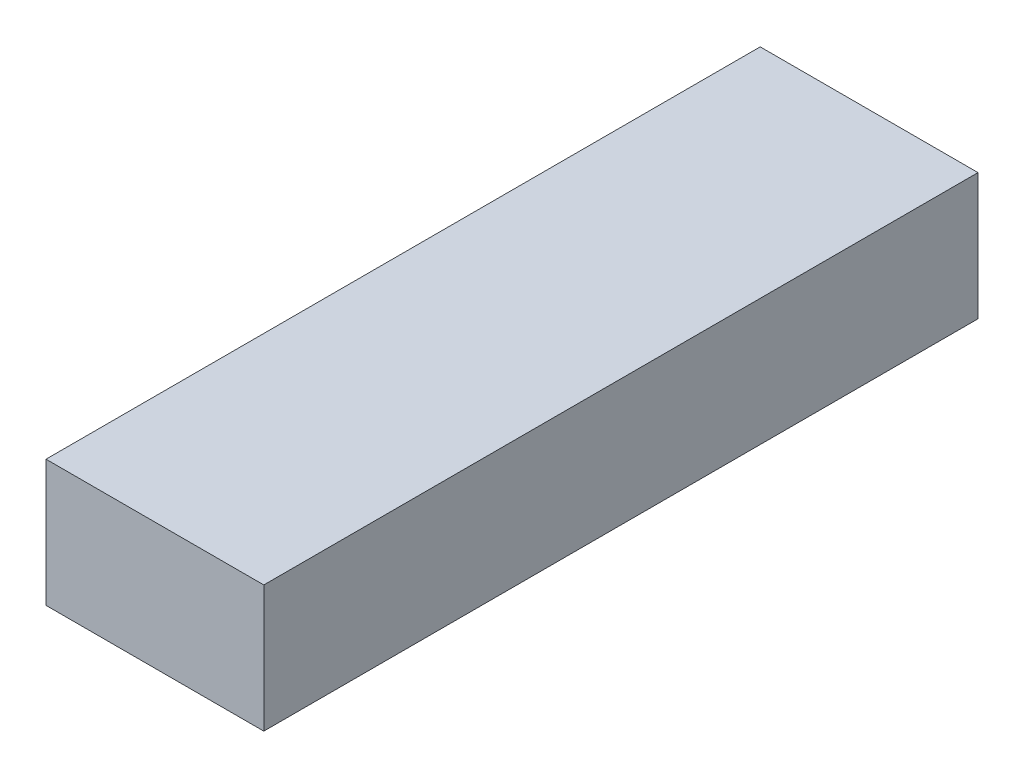
ISO-10303-21;
HEADER;
FILE_DESCRIPTION(('STEP AP214'),'2;1');
FILE_NAME('part.step','',(''),(''),'','','');
FILE_SCHEMA(('AUTOMOTIVE_DESIGN { 1 0 10303 214 1 1 1 1 }'));
ENDSEC;
DATA;
#1=APPLICATION_CONTEXT('core data for automotive mechanical design processes');
#2=APPLICATION_PROTOCOL_DEFINITION('international standard','automotive_design',2000,#1);
#3=PRODUCT_CONTEXT('',#1,'mechanical');
#4=PRODUCT('Part','Part','',(#3));
#5=PRODUCT_RELATED_PRODUCT_CATEGORY('part','',(#4));
#6=PRODUCT_DEFINITION_FORMATION('','',#4);
#7=PRODUCT_DEFINITION_CONTEXT('part definition',#1,'design');
#8=PRODUCT_DEFINITION('design','',#6,#7);
#9=PRODUCT_DEFINITION_SHAPE('','',#8);
#10=(LENGTH_UNIT() NAMED_UNIT(*) SI_UNIT(.MILLI.,.METRE.));
#11=(NAMED_UNIT(*) PLANE_ANGLE_UNIT() SI_UNIT($,.RADIAN.));
#12=(NAMED_UNIT(*) SI_UNIT($,.STERADIAN.) SOLID_ANGLE_UNIT());
#13=UNCERTAINTY_MEASURE_WITH_UNIT(LENGTH_MEASURE(1.E-05),#10,'distance_accuracy_value','');
#14=(GEOMETRIC_REPRESENTATION_CONTEXT(3) GLOBAL_UNCERTAINTY_ASSIGNED_CONTEXT((#13)) GLOBAL_UNIT_ASSIGNED_CONTEXT((#10,
#11,#12)) REPRESENTATION_CONTEXT('',''));
#15=CARTESIAN_POINT('',(0.,0.,0.));
#16=DIRECTION('',(0.,0.,1.));
#17=DIRECTION('',(1.,0.,0.));
#18=AXIS2_PLACEMENT_3D('',#15,#16,#17);
#19=CARTESIAN_POINT('',(21.5,-12.5,141.));
#20=DIRECTION('',(-1.,0.,0.));
#21=DIRECTION('',(0.,0.,1.));
#22=AXIS2_PLACEMENT_3D('',#19,#20,#21);
#23=PLANE('',#22);
#24=DIRECTION('',(0.,1.,0.));
#25=VECTOR('',#24,1.);
#26=CARTESIAN_POINT('',(21.5,-12.5,0.));
#27=LINE('',#26,#25);
#28=CARTESIAN_POINT('',(21.5,-12.5,0.));
#29=VERTEX_POINT('',#28);
#30=CARTESIAN_POINT('',(21.5,12.5,0.));
#31=VERTEX_POINT('',#30);
#32=EDGE_CURVE('E96',#29,#31,#27,.T.);
#33=ORIENTED_EDGE('',*,*,#32,.T.);
#34=DIRECTION('',(0.,0.,-1.));
#35=VECTOR('',#34,1.);
#36=CARTESIAN_POINT('',(21.5,12.5,141.));
#37=LINE('',#36,#35);
#38=CARTESIAN_POINT('',(21.5,12.5,141.));
#39=VERTEX_POINT('',#38);
#40=EDGE_CURVE('E11',#39,#31,#37,.T.);
#41=ORIENTED_EDGE('',*,*,#40,.F.);
#42=DIRECTION('',(0.,1.,0.));
#43=VECTOR('',#42,1.);
#44=CARTESIAN_POINT('',(21.5,-12.5,141.));
#45=LINE('',#44,#43);
#46=CARTESIAN_POINT('',(21.5,-12.5,141.));
#47=VERTEX_POINT('',#46);
#48=EDGE_CURVE('E84',#47,#39,#45,.T.);
#49=ORIENTED_EDGE('',*,*,#48,.F.);
#50=DIRECTION('',(0.,0.,-1.));
#51=VECTOR('',#50,1.);
#52=CARTESIAN_POINT('',(21.5,-12.5,141.));
#53=LINE('',#52,#51);
#54=EDGE_CURVE('E92',#47,#29,#53,.T.);
#55=ORIENTED_EDGE('',*,*,#54,.T.);
#56=EDGE_LOOP('',(#33,#41,#49,#55));
#57=FACE_BOUND('',#56,.T.);
#58=ADVANCED_FACE('F33',(#57),#23,.F.);
#59=CARTESIAN_POINT('',(-21.5,12.5,141.));
#60=DIRECTION('',(0.,-1.,0.));
#61=DIRECTION('',(0.,0.,-1.));
#62=AXIS2_PLACEMENT_3D('',#59,#60,#61);
#63=PLANE('',#62);
#64=DIRECTION('',(-1.,0.,0.));
#65=VECTOR('',#64,1.);
#66=CARTESIAN_POINT('',(-21.5,12.5,0.));
#67=LINE('',#66,#65);
#68=CARTESIAN_POINT('',(-21.5,12.5,0.));
#69=VERTEX_POINT('',#68);
#70=EDGE_CURVE('E88',#31,#69,#67,.T.);
#71=ORIENTED_EDGE('',*,*,#70,.T.);
#72=DIRECTION('',(0.,0.,-1.));
#73=VECTOR('',#72,1.);
#74=CARTESIAN_POINT('',(-21.5,12.5,141.));
#75=LINE('',#74,#73);
#76=CARTESIAN_POINT('',(-21.5,12.5,141.));
#77=VERTEX_POINT('',#76);
#78=EDGE_CURVE('E41',#77,#69,#75,.T.);
#79=ORIENTED_EDGE('',*,*,#78,.F.);
#80=DIRECTION('',(-1.,0.,0.));
#81=VECTOR('',#80,1.);
#82=CARTESIAN_POINT('',(-21.5,12.5,141.));
#83=LINE('',#82,#81);
#84=EDGE_CURVE('E79',#39,#77,#83,.T.);
#85=ORIENTED_EDGE('',*,*,#84,.F.);
#86=ORIENTED_EDGE('',*,*,#40,.T.);
#87=EDGE_LOOP('',(#71,#79,#85,#86));
#88=FACE_BOUND('',#87,.T.);
#89=ADVANCED_FACE('F87',(#88),#63,.F.);
#90=CARTESIAN_POINT('',(-21.5,-12.5,141.));
#91=DIRECTION('',(1.,0.,0.));
#92=DIRECTION('',(0.,0.,-1.));
#93=AXIS2_PLACEMENT_3D('',#90,#91,#92);
#94=PLANE('',#93);
#95=DIRECTION('',(0.,-1.,0.));
#96=VECTOR('',#95,1.);
#97=CARTESIAN_POINT('',(-21.5,-12.5,0.));
#98=LINE('',#97,#96);
#99=CARTESIAN_POINT('',(-21.5,-12.5,0.));
#100=VERTEX_POINT('',#99);
#101=EDGE_CURVE('E66',#69,#100,#98,.T.);
#102=ORIENTED_EDGE('',*,*,#101,.T.);
#103=DIRECTION('',(0.,0.,-1.));
#104=VECTOR('',#103,1.);
#105=CARTESIAN_POINT('',(-21.5,-12.5,141.));
#106=LINE('',#105,#104);
#107=CARTESIAN_POINT('',(-21.5,-12.5,141.));
#108=VERTEX_POINT('',#107);
#109=EDGE_CURVE('E89',#108,#100,#106,.T.);
#110=ORIENTED_EDGE('',*,*,#109,.F.);
#111=DIRECTION('',(0.,-1.,0.));
#112=VECTOR('',#111,1.);
#113=CARTESIAN_POINT('',(-21.5,-12.5,141.));
#114=LINE('',#113,#112);
#115=EDGE_CURVE('E82',#77,#108,#114,.T.);
#116=ORIENTED_EDGE('',*,*,#115,.F.);
#117=ORIENTED_EDGE('',*,*,#78,.T.);
#118=EDGE_LOOP('',(#102,#110,#116,#117));
#119=FACE_BOUND('',#118,.T.);
#120=ADVANCED_FACE('F90',(#119),#94,.F.);
#121=CARTESIAN_POINT('',(-21.5,-12.5,141.));
#122=DIRECTION('',(0.,1.,0.));
#123=DIRECTION('',(0.,0.,1.));
#124=AXIS2_PLACEMENT_3D('',#121,#122,#123);
#125=PLANE('',#124);
#126=DIRECTION('',(1.,0.,0.));
#127=VECTOR('',#126,1.);
#128=CARTESIAN_POINT('',(-21.5,-12.5,0.));
#129=LINE('',#128,#127);
#130=EDGE_CURVE('E72',#100,#29,#129,.T.);
#131=ORIENTED_EDGE('',*,*,#130,.T.);
#132=ORIENTED_EDGE('',*,*,#54,.F.);
#133=DIRECTION('',(1.,0.,0.));
#134=VECTOR('',#133,1.);
#135=CARTESIAN_POINT('',(-21.5,-12.5,141.));
#136=LINE('',#135,#134);
#137=EDGE_CURVE('E49',#108,#47,#136,.T.);
#138=ORIENTED_EDGE('',*,*,#137,.F.);
#139=ORIENTED_EDGE('',*,*,#109,.T.);
#140=EDGE_LOOP('',(#131,#132,#138,#139));
#141=FACE_BOUND('',#140,.T.);
#142=ADVANCED_FACE('F103',(#141),#125,.F.);
#143=CARTESIAN_POINT('',(0.,0.,141.));
#144=DIRECTION('',(0.,0.,-1.));
#145=DIRECTION('',(-1.,0.,0.));
#146=AXIS2_PLACEMENT_3D('',#143,#144,#145);
#147=PLANE('',#146);
#148=ORIENTED_EDGE('',*,*,#48,.T.);
#149=ORIENTED_EDGE('',*,*,#84,.T.);
#150=ORIENTED_EDGE('',*,*,#115,.T.);
#151=ORIENTED_EDGE('',*,*,#137,.T.);
#152=EDGE_LOOP('',(#148,#149,#150,#151));
#153=FACE_BOUND('',#152,.T.);
#154=ADVANCED_FACE('F80',(#153),#147,.F.);
#155=CARTESIAN_POINT('',(0.,0.,0.));
#156=DIRECTION('',(0.,0.,-1.));
#157=DIRECTION('',(-1.,0.,0.));
#158=AXIS2_PLACEMENT_3D('',#155,#156,#157);
#159=PLANE('',#158);
#160=ORIENTED_EDGE('',*,*,#32,.F.);
#161=ORIENTED_EDGE('',*,*,#130,.F.);
#162=ORIENTED_EDGE('',*,*,#101,.F.);
#163=ORIENTED_EDGE('',*,*,#70,.F.);
#164=EDGE_LOOP('',(#160,#161,#162,#163));
#165=FACE_BOUND('',#164,.T.);
#166=ADVANCED_FACE('F106',(#165),#159,.T.);
#167=CLOSED_SHELL('',(#58,#89,#120,#142,#154,#166));
#168=MANIFOLD_SOLID_BREP('B2',#167);
#169=ADVANCED_BREP_SHAPE_REPRESENTATION('',(#18,#168),#14);
#170=SHAPE_DEFINITION_REPRESENTATION(#9,#169);
ENDSEC;
END-ISO-10303-21;
